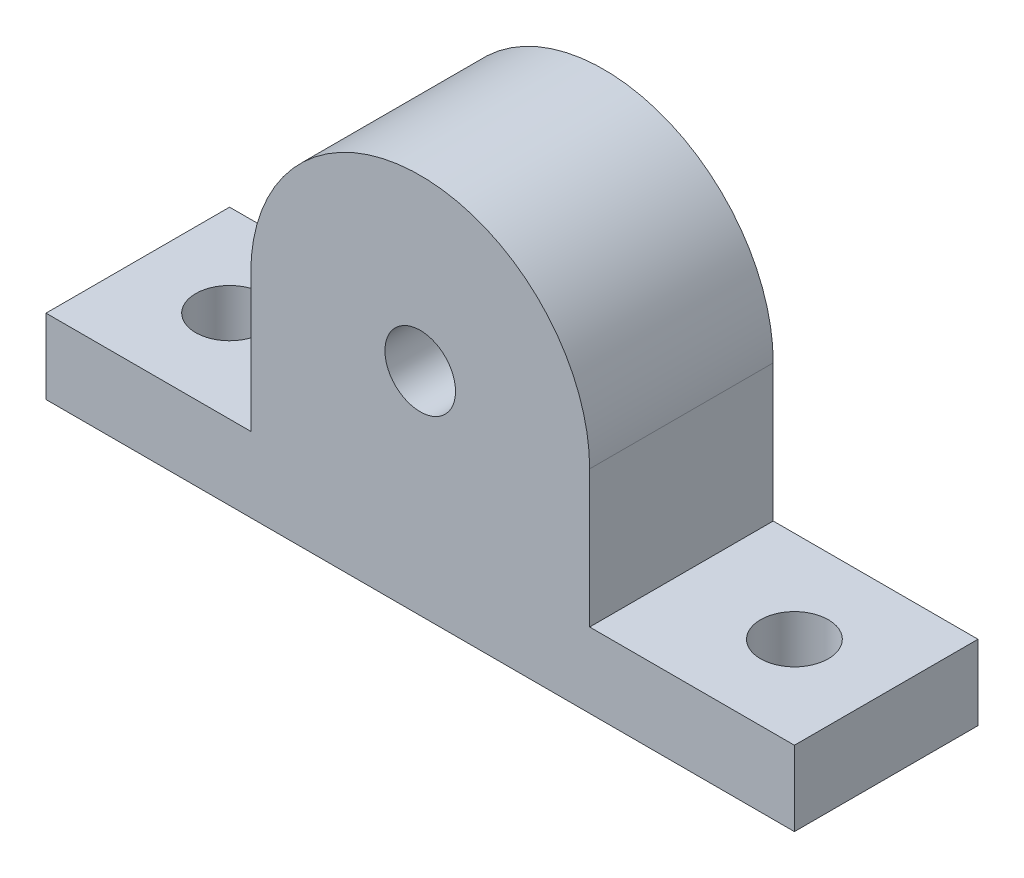
ISO-10303-21;
HEADER;
FILE_DESCRIPTION(('STEP AP214'),'2;1');
FILE_NAME('part.step','',(''),(''),'','','');
FILE_SCHEMA(('AUTOMOTIVE_DESIGN { 1 0 10303 214 1 1 1 1 }'));
ENDSEC;
DATA;
#1=APPLICATION_CONTEXT('core data for automotive mechanical design processes');
#2=APPLICATION_PROTOCOL_DEFINITION('international standard','automotive_design',2000,#1);
#3=PRODUCT_CONTEXT('',#1,'mechanical');
#4=PRODUCT('Part','Part','',(#3));
#5=PRODUCT_RELATED_PRODUCT_CATEGORY('part','',(#4));
#6=PRODUCT_DEFINITION_FORMATION('','',#4);
#7=PRODUCT_DEFINITION_CONTEXT('part definition',#1,'design');
#8=PRODUCT_DEFINITION('design','',#6,#7);
#9=PRODUCT_DEFINITION_SHAPE('','',#8);
#10=(LENGTH_UNIT() NAMED_UNIT(*) SI_UNIT(.MILLI.,.METRE.));
#11=(NAMED_UNIT(*) PLANE_ANGLE_UNIT() SI_UNIT($,.RADIAN.));
#12=(NAMED_UNIT(*) SI_UNIT($,.STERADIAN.) SOLID_ANGLE_UNIT());
#13=UNCERTAINTY_MEASURE_WITH_UNIT(LENGTH_MEASURE(1.E-05),#10,'distance_accuracy_value','');
#14=(GEOMETRIC_REPRESENTATION_CONTEXT(3) GLOBAL_UNCERTAINTY_ASSIGNED_CONTEXT((#13)) GLOBAL_UNIT_ASSIGNED_CONTEXT((#10,
#11,#12)) REPRESENTATION_CONTEXT('',''));
#15=CARTESIAN_POINT('',(0.,0.,0.));
#16=DIRECTION('',(0.,0.,1.));
#17=DIRECTION('',(1.,0.,0.));
#18=AXIS2_PLACEMENT_3D('',#15,#16,#17);
#19=CARTESIAN_POINT('',(26.5,-9.7,13.));
#20=DIRECTION('',(0.,-1.,0.));
#21=DIRECTION('',(1.,0.,0.));
#22=AXIS2_PLACEMENT_3D('',#19,#20,#21);
#23=PLANE('',#22);
#24=CARTESIAN_POINT('',(20.,-9.7,6.5));
#25=DIRECTION('',(0.,1.,0.));
#26=DIRECTION('',(-1.,0.,0.));
#27=AXIS2_PLACEMENT_3D('',#24,#25,#26);
#28=CIRCLE('',#27,2.4);
#29=CARTESIAN_POINT('',(17.6,-9.7,6.5));
#30=VERTEX_POINT('',#29);
#31=EDGE_CURVE('E165',#30,#30,#28,.T.);
#32=ORIENTED_EDGE('',*,*,#31,.F.);
#33=EDGE_LOOP('',(#32));
#34=FACE_BOUND('',#33,.T.);
#35=DIRECTION('',(-1.,0.,0.));
#36=VECTOR('',#35,1.);
#37=CARTESIAN_POINT('',(26.5,-9.7,0.));
#38=LINE('',#37,#36);
#39=CARTESIAN_POINT('',(26.5,-9.7,0.));
#40=VERTEX_POINT('',#39);
#41=CARTESIAN_POINT('',(12.,-9.7,0.));
#42=VERTEX_POINT('',#41);
#43=EDGE_CURVE('E137',#40,#42,#38,.T.);
#44=ORIENTED_EDGE('',*,*,#43,.T.);
#45=DIRECTION('',(0.,0.,-1.));
#46=VECTOR('',#45,1.);
#47=CARTESIAN_POINT('',(12.,-9.7,13.));
#48=LINE('',#47,#46);
#49=CARTESIAN_POINT('',(12.,-9.7,13.));
#50=VERTEX_POINT('',#49);
#51=EDGE_CURVE('E11',#50,#42,#48,.T.);
#52=ORIENTED_EDGE('',*,*,#51,.F.);
#53=DIRECTION('',(-1.,0.,0.));
#54=VECTOR('',#53,1.);
#55=CARTESIAN_POINT('',(26.5,-9.7,13.));
#56=LINE('',#55,#54);
#57=CARTESIAN_POINT('',(26.5,-9.7,13.));
#58=VERTEX_POINT('',#57);
#59=EDGE_CURVE('E152',#58,#50,#56,.T.);
#60=ORIENTED_EDGE('',*,*,#59,.F.);
#61=DIRECTION('',(0.,0.,-1.));
#62=VECTOR('',#61,1.);
#63=CARTESIAN_POINT('',(26.5,-9.7,13.));
#64=LINE('',#63,#62);
#65=EDGE_CURVE('E133',#58,#40,#64,.T.);
#66=ORIENTED_EDGE('',*,*,#65,.T.);
#67=EDGE_LOOP('',(#44,#52,#60,#66));
#68=FACE_BOUND('',#67,.T.);
#69=ADVANCED_FACE('F39',(#34,#68),#23,.F.);
#70=CARTESIAN_POINT('',(12.,0.,13.));
#71=DIRECTION('',(-1.,0.,0.));
#72=DIRECTION('',(0.,-1.,0.));
#73=AXIS2_PLACEMENT_3D('',#70,#71,#72);
#74=PLANE('',#73);
#75=DIRECTION('',(0.,1.,0.));
#76=VECTOR('',#75,1.);
#77=CARTESIAN_POINT('',(12.,0.,0.));
#78=LINE('',#77,#76);
#79=CARTESIAN_POINT('',(12.,0.,0.));
#80=VERTEX_POINT('',#79);
#81=EDGE_CURVE('E140',#42,#80,#78,.T.);
#82=ORIENTED_EDGE('',*,*,#81,.T.);
#83=DIRECTION('',(0.,0.,-1.));
#84=VECTOR('',#83,1.);
#85=CARTESIAN_POINT('',(12.,0.,13.));
#86=LINE('',#85,#84);
#87=CARTESIAN_POINT('',(12.,0.,13.));
#88=VERTEX_POINT('',#87);
#89=EDGE_CURVE('E48',#88,#80,#86,.T.);
#90=ORIENTED_EDGE('',*,*,#89,.F.);
#91=DIRECTION('',(0.,1.,0.));
#92=VECTOR('',#91,1.);
#93=CARTESIAN_POINT('',(12.,0.,13.));
#94=LINE('',#93,#92);
#95=EDGE_CURVE('E100',#50,#88,#94,.T.);
#96=ORIENTED_EDGE('',*,*,#95,.F.);
#97=ORIENTED_EDGE('',*,*,#51,.T.);
#98=EDGE_LOOP('',(#82,#90,#96,#97));
#99=FACE_BOUND('',#98,.T.);
#100=ADVANCED_FACE('F218',(#99),#74,.F.);
#101=CARTESIAN_POINT('',(0.,0.,13.));
#102=DIRECTION('',(0.,0.,-1.));
#103=DIRECTION('',(-1.,0.,0.));
#104=AXIS2_PLACEMENT_3D('',#101,#102,#103);
#105=CYLINDRICAL_SURFACE('',#104,12.);
#106=CARTESIAN_POINT('',(0.,0.,0.));
#107=DIRECTION('',(0.,0.,1.));
#108=DIRECTION('',(1.,0.,0.));
#109=AXIS2_PLACEMENT_3D('',#106,#107,#108);
#110=CIRCLE('',#109,12.);
#111=CARTESIAN_POINT('',(-12.,0.,0.));
#112=VERTEX_POINT('',#111);
#113=EDGE_CURVE('E143',#80,#112,#110,.T.);
#114=ORIENTED_EDGE('',*,*,#113,.T.);
#115=DIRECTION('',(0.,0.,-1.));
#116=VECTOR('',#115,1.);
#117=CARTESIAN_POINT('',(-12.,0.,13.));
#118=LINE('',#117,#116);
#119=CARTESIAN_POINT('',(-12.,0.,13.));
#120=VERTEX_POINT('',#119);
#121=EDGE_CURVE('E159',#120,#112,#118,.T.);
#122=ORIENTED_EDGE('',*,*,#121,.F.);
#123=CARTESIAN_POINT('',(0.,0.,13.));
#124=DIRECTION('',(0.,0.,1.));
#125=DIRECTION('',(1.,0.,0.));
#126=AXIS2_PLACEMENT_3D('',#123,#124,#125);
#127=CIRCLE('',#126,12.);
#128=EDGE_CURVE('E184',#88,#120,#127,.T.);
#129=ORIENTED_EDGE('',*,*,#128,.F.);
#130=ORIENTED_EDGE('',*,*,#89,.T.);
#131=EDGE_LOOP('',(#114,#122,#129,#130));
#132=FACE_BOUND('',#131,.T.);
#133=ADVANCED_FACE('F225',(#132),#105,.T.);
#134=CARTESIAN_POINT('',(-12.,0.,13.));
#135=DIRECTION('',(1.,0.,0.));
#136=DIRECTION('',(0.,1.,0.));
#137=AXIS2_PLACEMENT_3D('',#134,#135,#136);
#138=PLANE('',#137);
#139=DIRECTION('',(0.,-1.,0.));
#140=VECTOR('',#139,1.);
#141=CARTESIAN_POINT('',(-12.,0.,0.));
#142=LINE('',#141,#140);
#143=CARTESIAN_POINT('',(-12.,-9.7,0.));
#144=VERTEX_POINT('',#143);
#145=EDGE_CURVE('E145',#112,#144,#142,.T.);
#146=ORIENTED_EDGE('',*,*,#145,.T.);
#147=DIRECTION('',(0.,0.,-1.));
#148=VECTOR('',#147,1.);
#149=CARTESIAN_POINT('',(-12.,-9.7,13.));
#150=LINE('',#149,#148);
#151=CARTESIAN_POINT('',(-12.,-9.7,13.));
#152=VERTEX_POINT('',#151);
#153=EDGE_CURVE('E156',#152,#144,#150,.T.);
#154=ORIENTED_EDGE('',*,*,#153,.F.);
#155=DIRECTION('',(0.,-1.,0.));
#156=VECTOR('',#155,1.);
#157=CARTESIAN_POINT('',(-12.,0.,13.));
#158=LINE('',#157,#156);
#159=EDGE_CURVE('E186',#120,#152,#158,.T.);
#160=ORIENTED_EDGE('',*,*,#159,.F.);
#161=ORIENTED_EDGE('',*,*,#121,.T.);
#162=EDGE_LOOP('',(#146,#154,#160,#161));
#163=FACE_BOUND('',#162,.T.);
#164=ADVANCED_FACE('F192',(#163),#138,.F.);
#165=CARTESIAN_POINT('',(-12.,-9.7,13.));
#166=DIRECTION('',(0.,-1.,0.));
#167=DIRECTION('',(1.,0.,0.));
#168=AXIS2_PLACEMENT_3D('',#165,#166,#167);
#169=PLANE('',#168);
#170=CARTESIAN_POINT('',(-20.,-9.7,6.5));
#171=DIRECTION('',(0.,1.,0.));
#172=DIRECTION('',(-1.,0.,0.));
#173=AXIS2_PLACEMENT_3D('',#170,#171,#172);
#174=CIRCLE('',#173,2.4);
#175=CARTESIAN_POINT('',(-22.4,-9.7,6.5));
#176=VERTEX_POINT('',#175);
#177=EDGE_CURVE('E171',#176,#176,#174,.T.);
#178=ORIENTED_EDGE('',*,*,#177,.F.);
#179=EDGE_LOOP('',(#178));
#180=FACE_BOUND('',#179,.T.);
#181=DIRECTION('',(-1.,0.,0.));
#182=VECTOR('',#181,1.);
#183=CARTESIAN_POINT('',(-12.,-9.7,0.));
#184=LINE('',#183,#182);
#185=CARTESIAN_POINT('',(-26.5,-9.7,0.));
#186=VERTEX_POINT('',#185);
#187=EDGE_CURVE('E147',#144,#186,#184,.T.);
#188=ORIENTED_EDGE('',*,*,#187,.T.);
#189=DIRECTION('',(0.,0.,-1.));
#190=VECTOR('',#189,1.);
#191=CARTESIAN_POINT('',(-26.5,-9.7,13.));
#192=LINE('',#191,#190);
#193=CARTESIAN_POINT('',(-26.5,-9.7,13.));
#194=VERTEX_POINT('',#193);
#195=EDGE_CURVE('E128',#194,#186,#192,.T.);
#196=ORIENTED_EDGE('',*,*,#195,.F.);
#197=DIRECTION('',(-1.,0.,0.));
#198=VECTOR('',#197,1.);
#199=CARTESIAN_POINT('',(-12.,-9.7,13.));
#200=LINE('',#199,#198);
#201=EDGE_CURVE('E119',#152,#194,#200,.T.);
#202=ORIENTED_EDGE('',*,*,#201,.F.);
#203=ORIENTED_EDGE('',*,*,#153,.T.);
#204=EDGE_LOOP('',(#188,#196,#202,#203));
#205=FACE_BOUND('',#204,.T.);
#206=ADVANCED_FACE('F196',(#180,#205),#169,.F.);
#207=CARTESIAN_POINT('',(-26.5,-9.7,13.));
#208=DIRECTION('',(1.,0.,0.));
#209=DIRECTION('',(0.,1.,0.));
#210=AXIS2_PLACEMENT_3D('',#207,#208,#209);
#211=PLANE('',#210);
#212=DIRECTION('',(0.,-1.,0.));
#213=VECTOR('',#212,1.);
#214=CARTESIAN_POINT('',(-26.5,-9.7,0.));
#215=LINE('',#214,#213);
#216=CARTESIAN_POINT('',(-26.5,-15.,0.));
#217=VERTEX_POINT('',#216);
#218=EDGE_CURVE('E127',#186,#217,#215,.T.);
#219=ORIENTED_EDGE('',*,*,#218,.T.);
#220=DIRECTION('',(0.,0.,-1.));
#221=VECTOR('',#220,1.);
#222=CARTESIAN_POINT('',(-26.5,-15.,13.));
#223=LINE('',#222,#221);
#224=CARTESIAN_POINT('',(-26.5,-15.,13.));
#225=VERTEX_POINT('',#224);
#226=EDGE_CURVE('E124',#225,#217,#223,.T.);
#227=ORIENTED_EDGE('',*,*,#226,.F.);
#228=DIRECTION('',(0.,-1.,0.));
#229=VECTOR('',#228,1.);
#230=CARTESIAN_POINT('',(-26.5,-9.7,13.));
#231=LINE('',#230,#229);
#232=EDGE_CURVE('E113',#194,#225,#231,.T.);
#233=ORIENTED_EDGE('',*,*,#232,.F.);
#234=ORIENTED_EDGE('',*,*,#195,.T.);
#235=EDGE_LOOP('',(#219,#227,#233,#234));
#236=FACE_BOUND('',#235,.T.);
#237=ADVANCED_FACE('F125',(#236),#211,.F.);
#238=CARTESIAN_POINT('',(26.5,-15.,13.));
#239=DIRECTION('',(0.,1.,0.));
#240=DIRECTION('',(-1.,0.,0.));
#241=AXIS2_PLACEMENT_3D('',#238,#239,#240);
#242=PLANE('',#241);
#243=CARTESIAN_POINT('',(20.,-15.,6.5));
#244=DIRECTION('',(0.,1.,0.));
#245=DIRECTION('',(-1.,0.,0.));
#246=AXIS2_PLACEMENT_3D('',#243,#244,#245);
#247=CIRCLE('',#246,2.4);
#248=CARTESIAN_POINT('',(17.6,-15.,6.5));
#249=VERTEX_POINT('',#248);
#250=EDGE_CURVE('E42',#249,#249,#247,.T.);
#251=ORIENTED_EDGE('',*,*,#250,.T.);
#252=EDGE_LOOP('',(#251));
#253=FACE_BOUND('',#252,.T.);
#254=CARTESIAN_POINT('',(-20.,-15.,6.5));
#255=DIRECTION('',(0.,1.,0.));
#256=DIRECTION('',(-1.,0.,0.));
#257=AXIS2_PLACEMENT_3D('',#254,#255,#256);
#258=CIRCLE('',#257,2.4);
#259=CARTESIAN_POINT('',(-22.4,-15.,6.5));
#260=VERTEX_POINT('',#259);
#261=EDGE_CURVE('E163',#260,#260,#258,.T.);
#262=ORIENTED_EDGE('',*,*,#261,.T.);
#263=EDGE_LOOP('',(#262));
#264=FACE_BOUND('',#263,.T.);
#265=DIRECTION('',(1.,0.,0.));
#266=VECTOR('',#265,1.);
#267=CARTESIAN_POINT('',(26.5,-15.,0.));
#268=LINE('',#267,#266);
#269=CARTESIAN_POINT('',(26.5,-15.,0.));
#270=VERTEX_POINT('',#269);
#271=EDGE_CURVE('E86',#217,#270,#268,.T.);
#272=ORIENTED_EDGE('',*,*,#271,.T.);
#273=DIRECTION('',(0.,0.,-1.));
#274=VECTOR('',#273,1.);
#275=CARTESIAN_POINT('',(26.5,-15.,13.));
#276=LINE('',#275,#274);
#277=CARTESIAN_POINT('',(26.5,-15.,13.));
#278=VERTEX_POINT('',#277);
#279=EDGE_CURVE('E129',#278,#270,#276,.T.);
#280=ORIENTED_EDGE('',*,*,#279,.F.);
#281=DIRECTION('',(1.,0.,0.));
#282=VECTOR('',#281,1.);
#283=CARTESIAN_POINT('',(26.5,-15.,13.));
#284=LINE('',#283,#282);
#285=EDGE_CURVE('E117',#225,#278,#284,.T.);
#286=ORIENTED_EDGE('',*,*,#285,.F.);
#287=ORIENTED_EDGE('',*,*,#226,.T.);
#288=EDGE_LOOP('',(#272,#280,#286,#287));
#289=FACE_BOUND('',#288,.T.);
#290=ADVANCED_FACE('F131',(#253,#264,#289),#242,.F.);
#291=CARTESIAN_POINT('',(26.5,-9.7,13.));
#292=DIRECTION('',(-1.,0.,0.));
#293=DIRECTION('',(0.,-1.,0.));
#294=AXIS2_PLACEMENT_3D('',#291,#292,#293);
#295=PLANE('',#294);
#296=DIRECTION('',(0.,1.,0.));
#297=VECTOR('',#296,1.);
#298=CARTESIAN_POINT('',(26.5,-9.7,0.));
#299=LINE('',#298,#297);
#300=EDGE_CURVE('E92',#270,#40,#299,.T.);
#301=ORIENTED_EDGE('',*,*,#300,.T.);
#302=ORIENTED_EDGE('',*,*,#65,.F.);
#303=DIRECTION('',(0.,1.,0.));
#304=VECTOR('',#303,1.);
#305=CARTESIAN_POINT('',(26.5,-9.7,13.));
#306=LINE('',#305,#304);
#307=EDGE_CURVE('E57',#278,#58,#306,.T.);
#308=ORIENTED_EDGE('',*,*,#307,.F.);
#309=ORIENTED_EDGE('',*,*,#279,.T.);
#310=EDGE_LOOP('',(#301,#302,#308,#309));
#311=FACE_BOUND('',#310,.T.);
#312=ADVANCED_FACE('F204',(#311),#295,.F.);
#313=CARTESIAN_POINT('',(0.,0.,13.));
#314=DIRECTION('',(0.,0.,1.));
#315=DIRECTION('',(1.,0.,0.));
#316=AXIS2_PLACEMENT_3D('',#313,#314,#315);
#317=PLANE('',#316);
#318=CARTESIAN_POINT('',(0.,0.,13.));
#319=DIRECTION('',(0.,0.,1.));
#320=DIRECTION('',(1.,0.,0.));
#321=AXIS2_PLACEMENT_3D('',#318,#319,#320);
#322=CIRCLE('',#321,2.5);
#323=CARTESIAN_POINT('',(2.5,0.,13.));
#324=VERTEX_POINT('',#323);
#325=EDGE_CURVE('E169',#324,#324,#322,.T.);
#326=ORIENTED_EDGE('',*,*,#325,.F.);
#327=EDGE_LOOP('',(#326));
#328=FACE_BOUND('',#327,.T.);
#329=ORIENTED_EDGE('',*,*,#59,.T.);
#330=ORIENTED_EDGE('',*,*,#95,.T.);
#331=ORIENTED_EDGE('',*,*,#128,.T.);
#332=ORIENTED_EDGE('',*,*,#159,.T.);
#333=ORIENTED_EDGE('',*,*,#201,.T.);
#334=ORIENTED_EDGE('',*,*,#232,.T.);
#335=ORIENTED_EDGE('',*,*,#285,.T.);
#336=ORIENTED_EDGE('',*,*,#307,.T.);
#337=EDGE_LOOP('',(#329,#330,#331,#332,#333,#334,#335,#336));
#338=FACE_BOUND('',#337,.T.);
#339=ADVANCED_FACE('F115',(#328,#338),#317,.T.);
#340=CARTESIAN_POINT('',(0.,0.,0.));
#341=DIRECTION('',(0.,0.,1.));
#342=DIRECTION('',(1.,0.,0.));
#343=AXIS2_PLACEMENT_3D('',#340,#341,#342);
#344=PLANE('',#343);
#345=CARTESIAN_POINT('',(0.,0.,0.));
#346=DIRECTION('',(0.,0.,1.));
#347=DIRECTION('',(1.,0.,0.));
#348=AXIS2_PLACEMENT_3D('',#345,#346,#347);
#349=CIRCLE('',#348,2.5);
#350=CARTESIAN_POINT('',(2.5,0.,0.));
#351=VERTEX_POINT('',#350);
#352=EDGE_CURVE('E141',#351,#351,#349,.T.);
#353=ORIENTED_EDGE('',*,*,#352,.T.);
#354=EDGE_LOOP('',(#353));
#355=FACE_BOUND('',#354,.T.);
#356=ORIENTED_EDGE('',*,*,#43,.F.);
#357=ORIENTED_EDGE('',*,*,#300,.F.);
#358=ORIENTED_EDGE('',*,*,#271,.F.);
#359=ORIENTED_EDGE('',*,*,#218,.F.);
#360=ORIENTED_EDGE('',*,*,#187,.F.);
#361=ORIENTED_EDGE('',*,*,#145,.F.);
#362=ORIENTED_EDGE('',*,*,#113,.F.);
#363=ORIENTED_EDGE('',*,*,#81,.F.);
#364=EDGE_LOOP('',(#356,#357,#358,#359,#360,#361,#362,#363));
#365=FACE_BOUND('',#364,.T.);
#366=ADVANCED_FACE('F199',(#355,#365),#344,.F.);
#367=CARTESIAN_POINT('',(0.,0.,0.));
#368=DIRECTION('',(0.,0.,1.));
#369=DIRECTION('',(1.,0.,0.));
#370=AXIS2_PLACEMENT_3D('',#367,#368,#369);
#371=CYLINDRICAL_SURFACE('',#370,2.5);
#372=CARTESIAN_POINT('',(2.5,0.,0.));
#373=CARTESIAN_POINT('',(2.5,0.,0.135416666666666));
#374=CARTESIAN_POINT('',(2.5,0.,0.270833333333333));
#375=CARTESIAN_POINT('',(2.5,0.,0.541666666666667));
#376=CARTESIAN_POINT('',(2.5,0.,0.677083333333333));
#377=CARTESIAN_POINT('',(2.5,0.,0.947916666666667));
#378=CARTESIAN_POINT('',(2.5,0.,1.08333333333333));
#379=CARTESIAN_POINT('',(2.5,0.,1.35416666666667));
#380=CARTESIAN_POINT('',(2.5,0.,1.48958333333333));
#381=CARTESIAN_POINT('',(2.5,0.,1.76041666666667));
#382=CARTESIAN_POINT('',(2.5,0.,1.89583333333333));
#383=CARTESIAN_POINT('',(2.5,0.,2.16666666666667));
#384=CARTESIAN_POINT('',(2.5,0.,2.30208333333333));
#385=CARTESIAN_POINT('',(2.5,0.,2.57291666666667));
#386=CARTESIAN_POINT('',(2.5,0.,2.70833333333333));
#387=CARTESIAN_POINT('',(2.5,0.,2.97916666666667));
#388=CARTESIAN_POINT('',(2.5,0.,3.11458333333333));
#389=CARTESIAN_POINT('',(2.5,0.,3.38541666666667));
#390=CARTESIAN_POINT('',(2.5,0.,3.52083333333333));
#391=CARTESIAN_POINT('',(2.5,0.,3.79166666666667));
#392=CARTESIAN_POINT('',(2.5,0.,3.92708333333333));
#393=CARTESIAN_POINT('',(2.5,0.,4.19791666666667));
#394=CARTESIAN_POINT('',(2.5,0.,4.33333333333333));
#395=CARTESIAN_POINT('',(2.5,0.,4.60416666666667));
#396=CARTESIAN_POINT('',(2.5,0.,4.73958333333333));
#397=CARTESIAN_POINT('',(2.5,0.,5.01041666666667));
#398=CARTESIAN_POINT('',(2.5,0.,5.14583333333333));
#399=CARTESIAN_POINT('',(2.5,0.,5.41666666666667));
#400=CARTESIAN_POINT('',(2.5,0.,5.55208333333333));
#401=CARTESIAN_POINT('',(2.5,0.,5.82291666666667));
#402=CARTESIAN_POINT('',(2.5,0.,5.95833333333333));
#403=CARTESIAN_POINT('',(2.5,0.,6.22916666666667));
#404=CARTESIAN_POINT('',(2.5,0.,6.36458333333333));
#405=CARTESIAN_POINT('',(2.5,0.,6.63541666666667));
#406=CARTESIAN_POINT('',(2.5,0.,6.77083333333333));
#407=CARTESIAN_POINT('',(2.5,0.,7.04166666666667));
#408=CARTESIAN_POINT('',(2.5,0.,7.17708333333333));
#409=CARTESIAN_POINT('',(2.5,0.,7.44791666666667));
#410=CARTESIAN_POINT('',(2.5,0.,7.58333333333333));
#411=CARTESIAN_POINT('',(2.5,0.,7.85416666666667));
#412=CARTESIAN_POINT('',(2.5,0.,7.98958333333333));
#413=CARTESIAN_POINT('',(2.5,0.,8.26041666666667));
#414=CARTESIAN_POINT('',(2.5,0.,8.39583333333333));
#415=CARTESIAN_POINT('',(2.5,0.,8.66666666666667));
#416=CARTESIAN_POINT('',(2.5,0.,8.80208333333333));
#417=CARTESIAN_POINT('',(2.5,0.,9.07291666666667));
#418=CARTESIAN_POINT('',(2.5,0.,9.20833333333333));
#419=CARTESIAN_POINT('',(2.5,0.,9.47916666666667));
#420=CARTESIAN_POINT('',(2.5,0.,9.61458333333333));
#421=CARTESIAN_POINT('',(2.5,0.,9.88541666666667));
#422=CARTESIAN_POINT('',(2.5,0.,10.0208333333333));
#423=CARTESIAN_POINT('',(2.5,0.,10.2916666666667));
#424=CARTESIAN_POINT('',(2.5,0.,10.4270833333333));
#425=CARTESIAN_POINT('',(2.5,0.,10.6979166666667));
#426=CARTESIAN_POINT('',(2.5,0.,10.8333333333333));
#427=CARTESIAN_POINT('',(2.5,0.,11.1041666666667));
#428=CARTESIAN_POINT('',(2.5,0.,11.2395833333333));
#429=CARTESIAN_POINT('',(2.5,0.,11.5104166666667));
#430=CARTESIAN_POINT('',(2.5,0.,11.6458333333333));
#431=CARTESIAN_POINT('',(2.5,0.,11.9166666666667));
#432=CARTESIAN_POINT('',(2.5,0.,12.0520833333333));
#433=CARTESIAN_POINT('',(2.5,0.,12.3229166666667));
#434=CARTESIAN_POINT('',(2.5,0.,12.4583333333333));
#435=CARTESIAN_POINT('',(2.5,0.,12.7291666666667));
#436=CARTESIAN_POINT('',(2.5,0.,12.8645833333333));
#437=CARTESIAN_POINT('',(2.5,0.,13.));
#438=B_SPLINE_CURVE_WITH_KNOTS('',3,(#372,#373,#374,#375,#376,#377,#378,#379,#380,#381,#382,
#383,#384,#385,#386,#387,#388,#389,#390,#391,#392,#393,#394,#395,#396,#397,#398,#399,#400,#401,
#402,#403,#404,#405,#406,#407,#408,#409,#410,#411,#412,#413,#414,#415,#416,#417,#418,#419,#420,
#421,#422,#423,#424,#425,#426,#427,#428,#429,#430,#431,#432,#433,#434,#435,#436,#437),
.UNSPECIFIED.,.F.,.F.,(4,2,2,2,2,2,2,2,2,2,2,2,2,2,2,2,2,2,2,2,2,2,2,2,2,2,2,2,2,2,2,2,4),(0.,
0.40625,0.8125,1.21875,1.625,2.03125,2.4375,2.84375,3.25,3.65625,4.0625,4.46875,4.875,5.28125,
5.6875,6.09375,6.5,6.90625,7.3125,7.71875,8.125,8.53125,8.9375,9.34375,9.75,10.15625,10.5625,
10.96875,11.375,11.78125,12.1875,12.59375,13.),.UNSPECIFIED.);
#439=EDGE_CURVE('BSEAM286',#351,#324,#438,.T.);
#440=ORIENTED_EDGE('',*,*,#352,.F.);
#441=ORIENTED_EDGE('',*,*,#325,.T.);
#442=ORIENTED_EDGE('',*,*,#439,.T.);
#443=ORIENTED_EDGE('',*,*,#439,.F.);
#444=EDGE_LOOP('',(#440,#442,#441,#443));
#445=FACE_BOUND('',#444,.T.);
#446=ADVANCED_FACE('F286',(#445),#371,.F.);
#447=CARTESIAN_POINT('',(-20.,-22.7,6.5));
#448=DIRECTION('',(0.,1.,0.));
#449=DIRECTION('',(-1.,0.,0.));
#450=AXIS2_PLACEMENT_3D('',#447,#448,#449);
#451=CYLINDRICAL_SURFACE('',#450,2.4);
#452=CARTESIAN_POINT('',(-22.4,-9.7,6.5));
#453=CARTESIAN_POINT('',(-22.4,-9.75520833333334,6.5));
#454=CARTESIAN_POINT('',(-22.4,-9.81041666666667,6.5));
#455=CARTESIAN_POINT('',(-22.4,-9.92083333333334,6.5));
#456=CARTESIAN_POINT('',(-22.4,-9.97604166666667,6.5));
#457=CARTESIAN_POINT('',(-22.4,-10.0864583333333,6.5));
#458=CARTESIAN_POINT('',(-22.4,-10.1416666666667,6.5));
#459=CARTESIAN_POINT('',(-22.4,-10.2520833333333,6.5));
#460=CARTESIAN_POINT('',(-22.4,-10.3072916666667,6.5));
#461=CARTESIAN_POINT('',(-22.4,-10.4177083333333,6.5));
#462=CARTESIAN_POINT('',(-22.4,-10.4729166666667,6.5));
#463=CARTESIAN_POINT('',(-22.4,-10.5833333333333,6.5));
#464=CARTESIAN_POINT('',(-22.4,-10.6385416666667,6.5));
#465=CARTESIAN_POINT('',(-22.4,-10.7489583333333,6.5));
#466=CARTESIAN_POINT('',(-22.4,-10.8041666666667,6.5));
#467=CARTESIAN_POINT('',(-22.4,-10.9145833333333,6.5));
#468=CARTESIAN_POINT('',(-22.4,-10.9697916666667,6.5));
#469=CARTESIAN_POINT('',(-22.4,-11.0802083333333,6.5));
#470=CARTESIAN_POINT('',(-22.4,-11.1354166666667,6.5));
#471=CARTESIAN_POINT('',(-22.4,-11.2458333333333,6.5));
#472=CARTESIAN_POINT('',(-22.4,-11.3010416666667,6.5));
#473=CARTESIAN_POINT('',(-22.4,-11.4114583333333,6.5));
#474=CARTESIAN_POINT('',(-22.4,-11.4666666666667,6.5));
#475=CARTESIAN_POINT('',(-22.4,-11.5770833333333,6.5));
#476=CARTESIAN_POINT('',(-22.4,-11.6322916666667,6.5));
#477=CARTESIAN_POINT('',(-22.4,-11.7427083333333,6.5));
#478=CARTESIAN_POINT('',(-22.4,-11.7979166666667,6.5));
#479=CARTESIAN_POINT('',(-22.4,-11.9083333333333,6.5));
#480=CARTESIAN_POINT('',(-22.4,-11.9635416666667,6.5));
#481=CARTESIAN_POINT('',(-22.4,-12.0739583333333,6.5));
#482=CARTESIAN_POINT('',(-22.4,-12.1291666666667,6.5));
#483=CARTESIAN_POINT('',(-22.4,-12.2395833333333,6.5));
#484=CARTESIAN_POINT('',(-22.4,-12.2947916666667,6.5));
#485=CARTESIAN_POINT('',(-22.4,-12.4052083333333,6.5));
#486=CARTESIAN_POINT('',(-22.4,-12.4604166666667,6.5));
#487=CARTESIAN_POINT('',(-22.4,-12.5708333333333,6.5));
#488=CARTESIAN_POINT('',(-22.4,-12.6260416666667,6.5));
#489=CARTESIAN_POINT('',(-22.4,-12.7364583333333,6.5));
#490=CARTESIAN_POINT('',(-22.4,-12.7916666666667,6.5));
#491=CARTESIAN_POINT('',(-22.4,-12.9020833333333,6.5));
#492=CARTESIAN_POINT('',(-22.4,-12.9572916666667,6.5));
#493=CARTESIAN_POINT('',(-22.4,-13.0677083333333,6.5));
#494=CARTESIAN_POINT('',(-22.4,-13.1229166666667,6.5));
#495=CARTESIAN_POINT('',(-22.4,-13.2333333333333,6.5));
#496=CARTESIAN_POINT('',(-22.4,-13.2885416666667,6.5));
#497=CARTESIAN_POINT('',(-22.4,-13.3989583333333,6.5));
#498=CARTESIAN_POINT('',(-22.4,-13.4541666666667,6.5));
#499=CARTESIAN_POINT('',(-22.4,-13.5645833333333,6.5));
#500=CARTESIAN_POINT('',(-22.4,-13.6197916666667,6.5));
#501=CARTESIAN_POINT('',(-22.4,-13.7302083333333,6.5));
#502=CARTESIAN_POINT('',(-22.4,-13.7854166666667,6.5));
#503=CARTESIAN_POINT('',(-22.4,-13.8958333333333,6.5));
#504=CARTESIAN_POINT('',(-22.4,-13.9510416666667,6.5));
#505=CARTESIAN_POINT('',(-22.4,-14.0614583333333,6.5));
#506=CARTESIAN_POINT('',(-22.4,-14.1166666666667,6.5));
#507=CARTESIAN_POINT('',(-22.4,-14.2270833333333,6.5));
#508=CARTESIAN_POINT('',(-22.4,-14.2822916666667,6.5));
#509=CARTESIAN_POINT('',(-22.4,-14.3927083333333,6.5));
#510=CARTESIAN_POINT('',(-22.4,-14.4479166666667,6.5));
#511=CARTESIAN_POINT('',(-22.4,-14.5583333333333,6.5));
#512=CARTESIAN_POINT('',(-22.4,-14.6135416666667,6.5));
#513=CARTESIAN_POINT('',(-22.4,-14.7239583333333,6.5));
#514=CARTESIAN_POINT('',(-22.4,-14.7791666666667,6.5));
#515=CARTESIAN_POINT('',(-22.4,-14.8895833333333,6.5));
#516=CARTESIAN_POINT('',(-22.4,-14.9447916666667,6.5));
#517=CARTESIAN_POINT('',(-22.4,-15.,6.5));
#518=B_SPLINE_CURVE_WITH_KNOTS('',3,(#452,#453,#454,#455,#456,#457,#458,#459,#460,#461,#462,
#463,#464,#465,#466,#467,#468,#469,#470,#471,#472,#473,#474,#475,#476,#477,#478,#479,#480,#481,
#482,#483,#484,#485,#486,#487,#488,#489,#490,#491,#492,#493,#494,#495,#496,#497,#498,#499,#500,
#501,#502,#503,#504,#505,#506,#507,#508,#509,#510,#511,#512,#513,#514,#515,#516,#517),
.UNSPECIFIED.,.F.,.F.,(4,2,2,2,2,2,2,2,2,2,2,2,2,2,2,2,2,2,2,2,2,2,2,2,2,2,2,2,2,2,2,2,4),(0.,
0.165625000000001,0.33125,0.496875000000001,0.6625,0.828125000000001,0.99375,1.159375,1.325,
1.490625,1.65625,1.821875,1.9875,2.153125,2.31875,2.484375,2.65,2.815625,2.98125,3.146875,
3.3125,3.478125,3.64375,3.809375,3.975,4.140625,4.30625,4.471875,4.6375,4.803125,4.96875,
5.134375,5.3),.UNSPECIFIED.);
#519=EDGE_CURVE('BSEAM293',#176,#260,#518,.T.);
#520=ORIENTED_EDGE('',*,*,#177,.T.);
#521=ORIENTED_EDGE('',*,*,#261,.F.);
#522=ORIENTED_EDGE('',*,*,#519,.T.);
#523=ORIENTED_EDGE('',*,*,#519,.F.);
#524=EDGE_LOOP('',(#520,#522,#521,#523));
#525=FACE_BOUND('',#524,.T.);
#526=ADVANCED_FACE('F293',(#525),#451,.F.);
#527=CARTESIAN_POINT('',(20.,-22.7,6.5));
#528=DIRECTION('',(0.,1.,0.));
#529=DIRECTION('',(-1.,0.,0.));
#530=AXIS2_PLACEMENT_3D('',#527,#528,#529);
#531=CYLINDRICAL_SURFACE('',#530,2.4);
#532=CARTESIAN_POINT('',(17.6,-9.7,6.5));
#533=CARTESIAN_POINT('',(17.6,-9.75520833333333,6.5));
#534=CARTESIAN_POINT('',(17.6,-9.81041666666667,6.5));
#535=CARTESIAN_POINT('',(17.6,-9.92083333333333,6.5));
#536=CARTESIAN_POINT('',(17.6,-9.97604166666667,6.5));
#537=CARTESIAN_POINT('',(17.6,-10.0864583333333,6.5));
#538=CARTESIAN_POINT('',(17.6,-10.1416666666667,6.5));
#539=CARTESIAN_POINT('',(17.6,-10.2520833333333,6.5));
#540=CARTESIAN_POINT('',(17.6,-10.3072916666667,6.5));
#541=CARTESIAN_POINT('',(17.6,-10.4177083333333,6.5));
#542=CARTESIAN_POINT('',(17.6,-10.4729166666667,6.5));
#543=CARTESIAN_POINT('',(17.6,-10.5833333333333,6.5));
#544=CARTESIAN_POINT('',(17.6,-10.6385416666667,6.5));
#545=CARTESIAN_POINT('',(17.6,-10.7489583333333,6.5));
#546=CARTESIAN_POINT('',(17.6,-10.8041666666667,6.5));
#547=CARTESIAN_POINT('',(17.6,-10.9145833333333,6.5));
#548=CARTESIAN_POINT('',(17.6,-10.9697916666667,6.5));
#549=CARTESIAN_POINT('',(17.6,-11.0802083333333,6.5));
#550=CARTESIAN_POINT('',(17.6,-11.1354166666667,6.5));
#551=CARTESIAN_POINT('',(17.6,-11.2458333333333,6.5));
#552=CARTESIAN_POINT('',(17.6,-11.3010416666667,6.5));
#553=CARTESIAN_POINT('',(17.6,-11.4114583333333,6.5));
#554=CARTESIAN_POINT('',(17.6,-11.4666666666667,6.5));
#555=CARTESIAN_POINT('',(17.6,-11.5770833333333,6.5));
#556=CARTESIAN_POINT('',(17.6,-11.6322916666667,6.5));
#557=CARTESIAN_POINT('',(17.6,-11.7427083333333,6.5));
#558=CARTESIAN_POINT('',(17.6,-11.7979166666667,6.5));
#559=CARTESIAN_POINT('',(17.6,-11.9083333333333,6.5));
#560=CARTESIAN_POINT('',(17.6,-11.9635416666667,6.5));
#561=CARTESIAN_POINT('',(17.6,-12.0739583333333,6.5));
#562=CARTESIAN_POINT('',(17.6,-12.1291666666667,6.5));
#563=CARTESIAN_POINT('',(17.6,-12.2395833333333,6.5));
#564=CARTESIAN_POINT('',(17.6,-12.2947916666667,6.5));
#565=CARTESIAN_POINT('',(17.6,-12.4052083333333,6.5));
#566=CARTESIAN_POINT('',(17.6,-12.4604166666667,6.5));
#567=CARTESIAN_POINT('',(17.6,-12.5708333333333,6.5));
#568=CARTESIAN_POINT('',(17.6,-12.6260416666667,6.5));
#569=CARTESIAN_POINT('',(17.6,-12.7364583333333,6.5));
#570=CARTESIAN_POINT('',(17.6,-12.7916666666667,6.5));
#571=CARTESIAN_POINT('',(17.6,-12.9020833333333,6.5));
#572=CARTESIAN_POINT('',(17.6,-12.9572916666667,6.5));
#573=CARTESIAN_POINT('',(17.6,-13.0677083333333,6.5));
#574=CARTESIAN_POINT('',(17.6,-13.1229166666667,6.5));
#575=CARTESIAN_POINT('',(17.6,-13.2333333333333,6.5));
#576=CARTESIAN_POINT('',(17.6,-13.2885416666667,6.5));
#577=CARTESIAN_POINT('',(17.6,-13.3989583333333,6.5));
#578=CARTESIAN_POINT('',(17.6,-13.4541666666667,6.5));
#579=CARTESIAN_POINT('',(17.6,-13.5645833333333,6.5));
#580=CARTESIAN_POINT('',(17.6,-13.6197916666667,6.5));
#581=CARTESIAN_POINT('',(17.6,-13.7302083333333,6.5));
#582=CARTESIAN_POINT('',(17.6,-13.7854166666667,6.5));
#583=CARTESIAN_POINT('',(17.6,-13.8958333333333,6.5));
#584=CARTESIAN_POINT('',(17.6,-13.9510416666667,6.5));
#585=CARTESIAN_POINT('',(17.6,-14.0614583333333,6.5));
#586=CARTESIAN_POINT('',(17.6,-14.1166666666667,6.5));
#587=CARTESIAN_POINT('',(17.6,-14.2270833333333,6.5));
#588=CARTESIAN_POINT('',(17.6,-14.2822916666667,6.5));
#589=CARTESIAN_POINT('',(17.6,-14.3927083333333,6.5));
#590=CARTESIAN_POINT('',(17.6,-14.4479166666667,6.5));
#591=CARTESIAN_POINT('',(17.6,-14.5583333333333,6.5));
#592=CARTESIAN_POINT('',(17.6,-14.6135416666667,6.5));
#593=CARTESIAN_POINT('',(17.6,-14.7239583333333,6.5));
#594=CARTESIAN_POINT('',(17.6,-14.7791666666667,6.5));
#595=CARTESIAN_POINT('',(17.6,-14.8895833333333,6.5));
#596=CARTESIAN_POINT('',(17.6,-14.9447916666667,6.5));
#597=CARTESIAN_POINT('',(17.6,-15.,6.5));
#598=B_SPLINE_CURVE_WITH_KNOTS('',3,(#532,#533,#534,#535,#536,#537,#538,#539,#540,#541,#542,
#543,#544,#545,#546,#547,#548,#549,#550,#551,#552,#553,#554,#555,#556,#557,#558,#559,#560,#561,
#562,#563,#564,#565,#566,#567,#568,#569,#570,#571,#572,#573,#574,#575,#576,#577,#578,#579,#580,
#581,#582,#583,#584,#585,#586,#587,#588,#589,#590,#591,#592,#593,#594,#595,#596,#597),
.UNSPECIFIED.,.F.,.F.,(4,2,2,2,2,2,2,2,2,2,2,2,2,2,2,2,2,2,2,2,2,2,2,2,2,2,2,2,2,2,2,2,4),(0.,
0.165625000000001,0.33125,0.496875000000001,0.6625,0.828125000000001,0.99375,1.159375,1.325,
1.490625,1.65625,1.821875,1.9875,2.153125,2.31875,2.484375,2.65,2.815625,2.98125,3.146875,
3.3125,3.478125,3.64375,3.809375,3.975,4.140625,4.30625,4.471875,4.6375,4.803125,4.96875,
5.134375,5.3),.UNSPECIFIED.);
#599=EDGE_CURVE('BSEAM302',#30,#249,#598,.T.);
#600=ORIENTED_EDGE('',*,*,#31,.T.);
#601=ORIENTED_EDGE('',*,*,#250,.F.);
#602=ORIENTED_EDGE('',*,*,#599,.T.);
#603=ORIENTED_EDGE('',*,*,#599,.F.);
#604=EDGE_LOOP('',(#600,#602,#601,#603));
#605=FACE_BOUND('',#604,.T.);
#606=ADVANCED_FACE('F302',(#605),#531,.F.);
#607=CLOSED_SHELL('',(#69,#100,#133,#164,#206,#237,#290,#312,#339,#366,#446,#526,#606));
#608=MANIFOLD_SOLID_BREP('B2',#607);
#609=ADVANCED_BREP_SHAPE_REPRESENTATION('',(#18,#608),#14);
#610=SHAPE_DEFINITION_REPRESENTATION(#9,#609);
ENDSEC;
END-ISO-10303-21;
